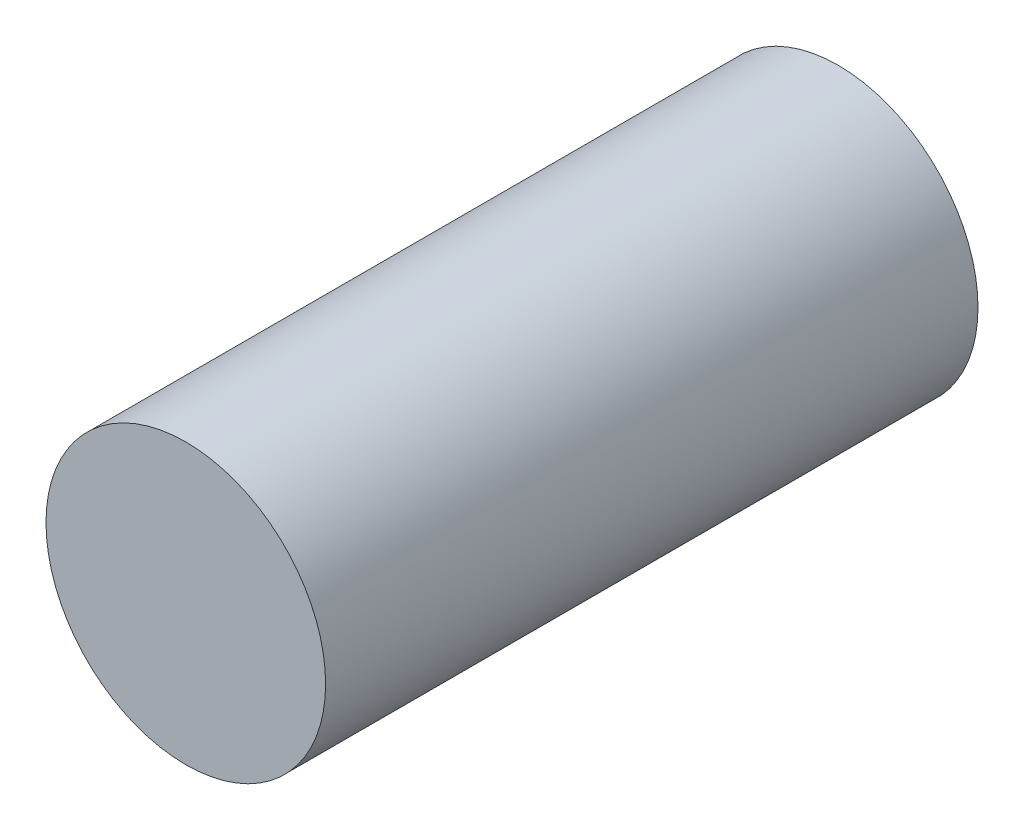
ISO-10303-21;
HEADER;
FILE_DESCRIPTION(('STEP AP214'),'2;1');
FILE_NAME('part.step','',(''),(''),'','','');
FILE_SCHEMA(('AUTOMOTIVE_DESIGN { 1 0 10303 214 1 1 1 1 }'));
ENDSEC;
DATA;
#1=APPLICATION_CONTEXT('core data for automotive mechanical design processes');
#2=APPLICATION_PROTOCOL_DEFINITION('international standard','automotive_design',2000,#1);
#3=PRODUCT_CONTEXT('',#1,'mechanical');
#4=PRODUCT('Part','Part','',(#3));
#5=PRODUCT_RELATED_PRODUCT_CATEGORY('part','',(#4));
#6=PRODUCT_DEFINITION_FORMATION('','',#4);
#7=PRODUCT_DEFINITION_CONTEXT('part definition',#1,'design');
#8=PRODUCT_DEFINITION('design','',#6,#7);
#9=PRODUCT_DEFINITION_SHAPE('','',#8);
#10=(LENGTH_UNIT() NAMED_UNIT(*) SI_UNIT(.MILLI.,.METRE.));
#11=(NAMED_UNIT(*) PLANE_ANGLE_UNIT() SI_UNIT($,.RADIAN.));
#12=(NAMED_UNIT(*) SI_UNIT($,.STERADIAN.) SOLID_ANGLE_UNIT());
#13=UNCERTAINTY_MEASURE_WITH_UNIT(LENGTH_MEASURE(1.E-05),#10,'distance_accuracy_value','');
#14=(GEOMETRIC_REPRESENTATION_CONTEXT(3) GLOBAL_UNCERTAINTY_ASSIGNED_CONTEXT((#13)) GLOBAL_UNIT_ASSIGNED_CONTEXT((#10,
#11,#12)) REPRESENTATION_CONTEXT('',''));
#15=CARTESIAN_POINT('',(0.,0.,0.));
#16=DIRECTION('',(0.,0.,1.));
#17=DIRECTION('',(1.,0.,0.));
#18=AXIS2_PLACEMENT_3D('',#15,#16,#17);
#19=CARTESIAN_POINT('',(0.,0.,35.));
#20=DIRECTION('',(0.,0.,-1.));
#21=DIRECTION('',(-1.,0.,0.));
#22=AXIS2_PLACEMENT_3D('',#19,#20,#21);
#23=CYLINDRICAL_SURFACE('',#22,7.5);
#24=CARTESIAN_POINT('',(0.,0.,35.));
#25=DIRECTION('',(0.,0.,1.));
#26=DIRECTION('',(1.,0.,0.));
#27=AXIS2_PLACEMENT_3D('',#24,#25,#26);
#28=CIRCLE('',#27,7.5);
#29=CARTESIAN_POINT('',(7.5,0.,35.));
#30=VERTEX_POINT('',#29);
#31=EDGE_CURVE('E10',#30,#30,#28,.T.);
#32=ORIENTED_EDGE('',*,*,#31,.F.);
#33=EDGE_LOOP('',(#32));
#34=FACE_BOUND('',#33,.T.);
#35=CARTESIAN_POINT('',(0.,0.,0.));
#36=DIRECTION('',(0.,0.,1.));
#37=DIRECTION('',(1.,0.,0.));
#38=AXIS2_PLACEMENT_3D('',#35,#36,#37);
#39=CIRCLE('',#38,7.5);
#40=CARTESIAN_POINT('',(7.5,0.,0.));
#41=VERTEX_POINT('',#40);
#42=EDGE_CURVE('E40',#41,#41,#39,.T.);
#43=ORIENTED_EDGE('',*,*,#42,.T.);
#44=EDGE_LOOP('',(#43));
#45=FACE_BOUND('',#44,.T.);
#46=ADVANCED_FACE('F37',(#34,#45),#23,.T.);
#47=CARTESIAN_POINT('',(0.,0.,35.));
#48=DIRECTION('',(0.,0.,1.));
#49=DIRECTION('',(1.,0.,0.));
#50=AXIS2_PLACEMENT_3D('',#47,#48,#49);
#51=PLANE('',#50);
#52=ORIENTED_EDGE('',*,*,#31,.T.);
#53=EDGE_LOOP('',(#52));
#54=FACE_BOUND('',#53,.T.);
#55=ADVANCED_FACE('F52',(#54),#51,.T.);
#56=CARTESIAN_POINT('',(0.,0.,0.));
#57=DIRECTION('',(0.,0.,1.));
#58=DIRECTION('',(1.,0.,0.));
#59=AXIS2_PLACEMENT_3D('',#56,#57,#58);
#60=PLANE('',#59);
#61=ORIENTED_EDGE('',*,*,#42,.F.);
#62=EDGE_LOOP('',(#61));
#63=FACE_BOUND('',#62,.T.);
#64=ADVANCED_FACE('F50',(#63),#60,.F.);
#65=CLOSED_SHELL('',(#46,#55,#64));
#66=MANIFOLD_SOLID_BREP('B2',#65);
#67=ADVANCED_BREP_SHAPE_REPRESENTATION('',(#18,#66),#14);
#68=SHAPE_DEFINITION_REPRESENTATION(#9,#67);
ENDSEC;
END-ISO-10303-21;
